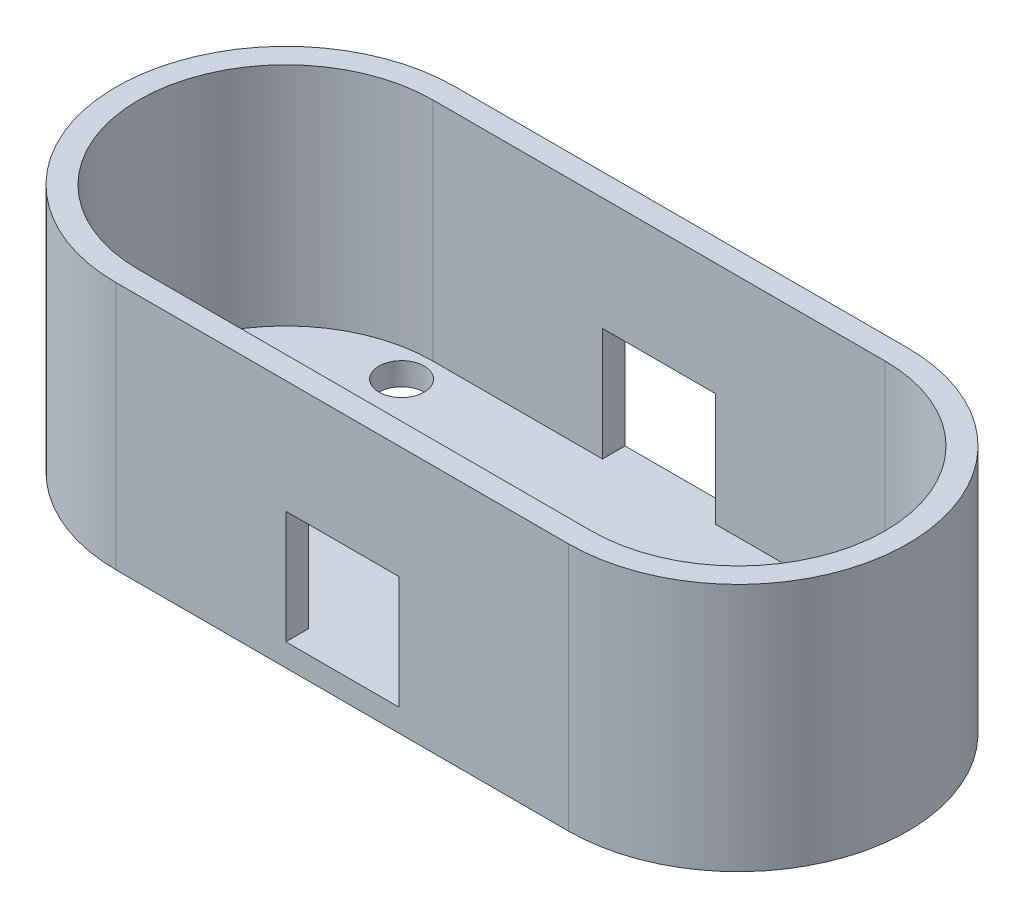
ISO-10303-21;
HEADER;
FILE_DESCRIPTION(('STEP AP214'),'2;1');
FILE_NAME('part.step','',(''),(''),'','','');
FILE_SCHEMA(('AUTOMOTIVE_DESIGN { 1 0 10303 214 1 1 1 1 }'));
ENDSEC;
DATA;
#1=APPLICATION_CONTEXT('core data for automotive mechanical design processes');
#2=APPLICATION_PROTOCOL_DEFINITION('international standard','automotive_design',2000,#1);
#3=PRODUCT_CONTEXT('',#1,'mechanical');
#4=PRODUCT('Part','Part','',(#3));
#5=PRODUCT_RELATED_PRODUCT_CATEGORY('part','',(#4));
#6=PRODUCT_DEFINITION_FORMATION('','',#4);
#7=PRODUCT_DEFINITION_CONTEXT('part definition',#1,'design');
#8=PRODUCT_DEFINITION('design','',#6,#7);
#9=PRODUCT_DEFINITION_SHAPE('','',#8);
#10=(LENGTH_UNIT() NAMED_UNIT(*) SI_UNIT(.MILLI.,.METRE.));
#11=(NAMED_UNIT(*) PLANE_ANGLE_UNIT() SI_UNIT($,.RADIAN.));
#12=(NAMED_UNIT(*) SI_UNIT($,.STERADIAN.) SOLID_ANGLE_UNIT());
#13=UNCERTAINTY_MEASURE_WITH_UNIT(LENGTH_MEASURE(1.E-05),#10,'distance_accuracy_value','');
#14=(GEOMETRIC_REPRESENTATION_CONTEXT(3) GLOBAL_UNCERTAINTY_ASSIGNED_CONTEXT((#13)) GLOBAL_UNIT_ASSIGNED_CONTEXT((#10,
#11,#12)) REPRESENTATION_CONTEXT('',''));
#15=CARTESIAN_POINT('',(0.,0.,0.));
#16=DIRECTION('',(0.,0.,1.));
#17=DIRECTION('',(1.,0.,0.));
#18=AXIS2_PLACEMENT_3D('',#15,#16,#17);
#19=CARTESIAN_POINT('',(0.,12.7,0.));
#20=DIRECTION('',(0.,1.,0.));
#21=DIRECTION('',(0.,0.,1.));
#22=AXIS2_PLACEMENT_3D('',#19,#20,#21);
#23=PLANE('',#22);
#24=CARTESIAN_POINT('',(0.,12.7,0.));
#25=DIRECTION('',(0.,1.,0.));
#26=DIRECTION('',(0.,0.,1.));
#27=AXIS2_PLACEMENT_3D('',#24,#25,#26);
#28=CIRCLE('',#27,9.525);
#29=CARTESIAN_POINT('',(0.,12.7,-9.525));
#30=VERTEX_POINT('',#29);
#31=CARTESIAN_POINT('',(0.,12.7,9.525));
#32=VERTEX_POINT('',#31);
#33=EDGE_CURVE('E255',#30,#32,#28,.T.);
#34=ORIENTED_EDGE('',*,*,#33,.T.);
#35=DIRECTION('',(1.,0.,0.));
#36=VECTOR('',#35,1.);
#37=CARTESIAN_POINT('',(0.,12.7,9.525));
#38=LINE('',#37,#36);
#39=CARTESIAN_POINT('',(25.4,12.7,9.525));
#40=VERTEX_POINT('',#39);
#41=EDGE_CURVE('E260',#32,#40,#38,.T.);
#42=ORIENTED_EDGE('',*,*,#41,.T.);
#43=CARTESIAN_POINT('',(25.4,12.7,0.));
#44=DIRECTION('',(0.,1.,0.));
#45=DIRECTION('',(0.,0.,1.));
#46=AXIS2_PLACEMENT_3D('',#43,#44,#45);
#47=CIRCLE('',#46,9.525);
#48=CARTESIAN_POINT('',(25.4,12.7,-9.525));
#49=VERTEX_POINT('',#48);
#50=EDGE_CURVE('E259',#40,#49,#47,.T.);
#51=ORIENTED_EDGE('',*,*,#50,.T.);
#52=DIRECTION('',(-1.,0.,0.));
#53=VECTOR('',#52,1.);
#54=CARTESIAN_POINT('',(0.,12.7,-9.525));
#55=LINE('',#54,#53);
#56=EDGE_CURVE('E261',#49,#30,#55,.T.);
#57=ORIENTED_EDGE('',*,*,#56,.T.);
#58=EDGE_LOOP('',(#34,#42,#51,#57));
#59=FACE_BOUND('',#58,.T.);
#60=DIRECTION('',(1.,0.,0.));
#61=VECTOR('',#60,1.);
#62=CARTESIAN_POINT('',(0.,12.7,8.255));
#63=LINE('',#62,#61);
#64=CARTESIAN_POINT('',(0.,12.7,8.255));
#65=VERTEX_POINT('',#64);
#66=CARTESIAN_POINT('',(25.4,12.7,8.255));
#67=VERTEX_POINT('',#66);
#68=EDGE_CURVE('E224',#65,#67,#63,.T.);
#69=ORIENTED_EDGE('',*,*,#68,.F.);
#70=CARTESIAN_POINT('',(0.,12.7,0.));
#71=DIRECTION('',(0.,1.,0.));
#72=DIRECTION('',(0.,0.,1.));
#73=AXIS2_PLACEMENT_3D('',#70,#71,#72);
#74=CIRCLE('',#73,8.255);
#75=CARTESIAN_POINT('',(0.,12.7,-8.255));
#76=VERTEX_POINT('',#75);
#77=EDGE_CURVE('E222',#76,#65,#74,.T.);
#78=ORIENTED_EDGE('',*,*,#77,.F.);
#79=DIRECTION('',(-1.,0.,0.));
#80=VECTOR('',#79,1.);
#81=CARTESIAN_POINT('',(0.,12.7,-8.255));
#82=LINE('',#81,#80);
#83=CARTESIAN_POINT('',(25.4,12.7,-8.255));
#84=VERTEX_POINT('',#83);
#85=EDGE_CURVE('E228',#84,#76,#82,.T.);
#86=ORIENTED_EDGE('',*,*,#85,.F.);
#87=CARTESIAN_POINT('',(25.4,12.7,0.));
#88=DIRECTION('',(0.,1.,0.));
#89=DIRECTION('',(0.,0.,1.));
#90=AXIS2_PLACEMENT_3D('',#87,#88,#89);
#91=CIRCLE('',#90,8.255);
#92=EDGE_CURVE('E229',#67,#84,#91,.T.);
#93=ORIENTED_EDGE('',*,*,#92,.F.);
#94=EDGE_LOOP('',(#69,#78,#86,#93));
#95=FACE_BOUND('',#94,.T.);
#96=ADVANCED_FACE('F39',(#59,#95),#23,.T.);
#97=CARTESIAN_POINT('',(0.,12.7,0.));
#98=DIRECTION('',(0.,-1.,0.));
#99=DIRECTION('',(0.,0.,-1.));
#100=AXIS2_PLACEMENT_3D('',#97,#98,#99);
#101=CYLINDRICAL_SURFACE('',#100,9.525);
#102=DIRECTION('',(0.,-1.,0.));
#103=VECTOR('',#102,1.);
#104=CARTESIAN_POINT('',(0.,12.7,-9.525));
#105=LINE('',#104,#103);
#106=CARTESIAN_POINT('',(0.,-1.27,-9.525));
#107=VERTEX_POINT('',#106);
#108=EDGE_CURVE('E263',#30,#107,#105,.T.);
#109=ORIENTED_EDGE('',*,*,#108,.T.);
#110=CARTESIAN_POINT('',(0.,-1.27,0.));
#111=DIRECTION('',(0.,-1.,0.));
#112=DIRECTION('',(0.,0.,-1.));
#113=AXIS2_PLACEMENT_3D('',#110,#111,#112);
#114=CIRCLE('',#113,9.525);
#115=CARTESIAN_POINT('',(0.,-1.27,9.525));
#116=VERTEX_POINT('',#115);
#117=EDGE_CURVE('E208',#116,#107,#114,.T.);
#118=ORIENTED_EDGE('',*,*,#117,.F.);
#119=DIRECTION('',(0.,-1.,0.));
#120=VECTOR('',#119,1.);
#121=CARTESIAN_POINT('',(0.,12.7,9.525));
#122=LINE('',#121,#120);
#123=EDGE_CURVE('E267',#32,#116,#122,.T.);
#124=ORIENTED_EDGE('',*,*,#123,.F.);
#125=ORIENTED_EDGE('',*,*,#33,.F.);
#126=EDGE_LOOP('',(#109,#118,#124,#125));
#127=FACE_BOUND('',#126,.T.);
#128=ADVANCED_FACE('F41',(#127),#101,.T.);
#129=CARTESIAN_POINT('',(0.,12.7,9.525));
#130=DIRECTION('',(0.,0.,-1.));
#131=DIRECTION('',(-1.,0.,0.));
#132=AXIS2_PLACEMENT_3D('',#129,#130,#131);
#133=PLANE('',#132);
#134=DIRECTION('',(-1.,0.,0.));
#135=VECTOR('',#134,1.);
#136=CARTESIAN_POINT('',(9.525,6.35,9.525));
#137=LINE('',#136,#135);
#138=CARTESIAN_POINT('',(15.875,6.35,9.525));
#139=VERTEX_POINT('',#138);
#140=CARTESIAN_POINT('',(9.525,6.35,9.525));
#141=VERTEX_POINT('',#140);
#142=EDGE_CURVE('E186',#139,#141,#137,.T.);
#143=ORIENTED_EDGE('',*,*,#142,.F.);
#144=DIRECTION('',(0.,1.,0.));
#145=VECTOR('',#144,1.);
#146=CARTESIAN_POINT('',(15.875,0.,9.525));
#147=LINE('',#146,#145);
#148=CARTESIAN_POINT('',(15.875,0.,9.525));
#149=VERTEX_POINT('',#148);
#150=EDGE_CURVE('E53',#149,#139,#147,.T.);
#151=ORIENTED_EDGE('',*,*,#150,.F.);
#152=DIRECTION('',(1.,0.,0.));
#153=VECTOR('',#152,1.);
#154=CARTESIAN_POINT('',(9.525,0.,9.525));
#155=LINE('',#154,#153);
#156=CARTESIAN_POINT('',(9.525,0.,9.525));
#157=VERTEX_POINT('',#156);
#158=EDGE_CURVE('E172',#157,#149,#155,.T.);
#159=ORIENTED_EDGE('',*,*,#158,.F.);
#160=DIRECTION('',(0.,-1.,0.));
#161=VECTOR('',#160,1.);
#162=CARTESIAN_POINT('',(9.525,0.,9.525));
#163=LINE('',#162,#161);
#164=EDGE_CURVE('E178',#141,#157,#163,.T.);
#165=ORIENTED_EDGE('',*,*,#164,.F.);
#166=EDGE_LOOP('',(#143,#151,#159,#165));
#167=FACE_BOUND('',#166,.T.);
#168=ORIENTED_EDGE('',*,*,#123,.T.);
#169=DIRECTION('',(-1.,0.,0.));
#170=VECTOR('',#169,1.);
#171=CARTESIAN_POINT('',(0.,-1.27,9.525));
#172=LINE('',#171,#170);
#173=CARTESIAN_POINT('',(25.4,-1.27,9.525));
#174=VERTEX_POINT('',#173);
#175=EDGE_CURVE('E220',#174,#116,#172,.T.);
#176=ORIENTED_EDGE('',*,*,#175,.F.);
#177=DIRECTION('',(0.,-1.,0.));
#178=VECTOR('',#177,1.);
#179=CARTESIAN_POINT('',(25.4,12.7,9.525));
#180=LINE('',#179,#178);
#181=EDGE_CURVE('E270',#40,#174,#180,.T.);
#182=ORIENTED_EDGE('',*,*,#181,.F.);
#183=ORIENTED_EDGE('',*,*,#41,.F.);
#184=EDGE_LOOP('',(#168,#176,#182,#183));
#185=FACE_BOUND('',#184,.T.);
#186=ADVANCED_FACE('F300',(#167,#185),#133,.F.);
#187=CARTESIAN_POINT('',(25.4,12.7,0.));
#188=DIRECTION('',(0.,-1.,0.));
#189=DIRECTION('',(0.,0.,-1.));
#190=AXIS2_PLACEMENT_3D('',#187,#188,#189);
#191=CYLINDRICAL_SURFACE('',#190,9.525);
#192=ORIENTED_EDGE('',*,*,#181,.T.);
#193=CARTESIAN_POINT('',(25.4,-1.27,0.));
#194=DIRECTION('',(0.,-1.,0.));
#195=DIRECTION('',(0.,0.,-1.));
#196=AXIS2_PLACEMENT_3D('',#193,#194,#195);
#197=CIRCLE('',#196,9.525);
#198=CARTESIAN_POINT('',(25.4,-1.27,-9.525));
#199=VERTEX_POINT('',#198);
#200=EDGE_CURVE('E212',#199,#174,#197,.T.);
#201=ORIENTED_EDGE('',*,*,#200,.F.);
#202=DIRECTION('',(0.,-1.,0.));
#203=VECTOR('',#202,1.);
#204=CARTESIAN_POINT('',(25.4,12.7,-9.525));
#205=LINE('',#204,#203);
#206=EDGE_CURVE('E264',#49,#199,#205,.T.);
#207=ORIENTED_EDGE('',*,*,#206,.F.);
#208=ORIENTED_EDGE('',*,*,#50,.F.);
#209=EDGE_LOOP('',(#192,#201,#207,#208));
#210=FACE_BOUND('',#209,.T.);
#211=ADVANCED_FACE('F321',(#210),#191,.T.);
#212=CARTESIAN_POINT('',(0.,12.7,-9.525));
#213=DIRECTION('',(0.,0.,1.));
#214=DIRECTION('',(1.,0.,0.));
#215=AXIS2_PLACEMENT_3D('',#212,#213,#214);
#216=PLANE('',#215);
#217=DIRECTION('',(1.,0.,0.));
#218=VECTOR('',#217,1.);
#219=CARTESIAN_POINT('',(9.525,0.,-9.525));
#220=LINE('',#219,#218);
#221=CARTESIAN_POINT('',(9.525,0.,-9.525));
#222=VERTEX_POINT('',#221);
#223=CARTESIAN_POINT('',(15.875,0.,-9.525));
#224=VERTEX_POINT('',#223);
#225=EDGE_CURVE('E173',#222,#224,#220,.T.);
#226=ORIENTED_EDGE('',*,*,#225,.T.);
#227=DIRECTION('',(0.,1.,0.));
#228=VECTOR('',#227,1.);
#229=CARTESIAN_POINT('',(15.875,0.,-9.525));
#230=LINE('',#229,#228);
#231=CARTESIAN_POINT('',(15.875,6.35,-9.525));
#232=VERTEX_POINT('',#231);
#233=EDGE_CURVE('E160',#224,#232,#230,.T.);
#234=ORIENTED_EDGE('',*,*,#233,.T.);
#235=DIRECTION('',(-1.,0.,0.));
#236=VECTOR('',#235,1.);
#237=CARTESIAN_POINT('',(9.525,6.35,-9.525));
#238=LINE('',#237,#236);
#239=CARTESIAN_POINT('',(9.525,6.35,-9.525));
#240=VERTEX_POINT('',#239);
#241=EDGE_CURVE('E167',#232,#240,#238,.T.);
#242=ORIENTED_EDGE('',*,*,#241,.T.);
#243=DIRECTION('',(0.,-1.,0.));
#244=VECTOR('',#243,1.);
#245=CARTESIAN_POINT('',(9.525,0.,-9.525));
#246=LINE('',#245,#244);
#247=EDGE_CURVE('E61',#240,#222,#246,.T.);
#248=ORIENTED_EDGE('',*,*,#247,.T.);
#249=EDGE_LOOP('',(#226,#234,#242,#248));
#250=FACE_BOUND('',#249,.T.);
#251=ORIENTED_EDGE('',*,*,#206,.T.);
#252=DIRECTION('',(1.,0.,0.));
#253=VECTOR('',#252,1.);
#254=CARTESIAN_POINT('',(0.,-1.27,-9.525));
#255=LINE('',#254,#253);
#256=EDGE_CURVE('E211',#107,#199,#255,.T.);
#257=ORIENTED_EDGE('',*,*,#256,.F.);
#258=ORIENTED_EDGE('',*,*,#108,.F.);
#259=ORIENTED_EDGE('',*,*,#56,.F.);
#260=EDGE_LOOP('',(#251,#257,#258,#259));
#261=FACE_BOUND('',#260,.T.);
#262=ADVANCED_FACE('F174',(#250,#261),#216,.F.);
#263=CARTESIAN_POINT('',(0.,12.7,0.));
#264=DIRECTION('',(0.,-1.,0.));
#265=DIRECTION('',(0.,0.,-1.));
#266=AXIS2_PLACEMENT_3D('',#263,#264,#265);
#267=CYLINDRICAL_SURFACE('',#266,8.255);
#268=CARTESIAN_POINT('',(0.,0.,0.));
#269=DIRECTION('',(0.,1.,0.));
#270=DIRECTION('',(0.,0.,1.));
#271=AXIS2_PLACEMENT_3D('',#268,#269,#270);
#272=CIRCLE('',#271,8.255);
#273=CARTESIAN_POINT('',(0.,0.,-8.255));
#274=VERTEX_POINT('',#273);
#275=CARTESIAN_POINT('',(0.,0.,8.255));
#276=VERTEX_POINT('',#275);
#277=EDGE_CURVE('E219',#274,#276,#272,.T.);
#278=ORIENTED_EDGE('',*,*,#277,.F.);
#279=DIRECTION('',(0.,-1.,0.));
#280=VECTOR('',#279,1.);
#281=CARTESIAN_POINT('',(0.,12.7,-8.255));
#282=LINE('',#281,#280);
#283=EDGE_CURVE('E231',#76,#274,#282,.T.);
#284=ORIENTED_EDGE('',*,*,#283,.F.);
#285=ORIENTED_EDGE('',*,*,#77,.T.);
#286=DIRECTION('',(0.,-1.,0.));
#287=VECTOR('',#286,1.);
#288=CARTESIAN_POINT('',(0.,12.7,8.255));
#289=LINE('',#288,#287);
#290=EDGE_CURVE('E253',#65,#276,#289,.T.);
#291=ORIENTED_EDGE('',*,*,#290,.T.);
#292=EDGE_LOOP('',(#278,#284,#285,#291));
#293=FACE_BOUND('',#292,.T.);
#294=ADVANCED_FACE('F283',(#293),#267,.F.);
#295=CARTESIAN_POINT('',(0.,12.7,8.255));
#296=DIRECTION('',(0.,0.,-1.));
#297=DIRECTION('',(-1.,0.,0.));
#298=AXIS2_PLACEMENT_3D('',#295,#296,#297);
#299=PLANE('',#298);
#300=DIRECTION('',(0.,-1.,0.));
#301=VECTOR('',#300,1.);
#302=CARTESIAN_POINT('',(15.875,12.7,8.255));
#303=LINE('',#302,#301);
#304=CARTESIAN_POINT('',(15.875,6.35,8.25499999999999));
#305=VERTEX_POINT('',#304);
#306=CARTESIAN_POINT('',(15.875,0.,8.25499999999999));
#307=VERTEX_POINT('',#306);
#308=EDGE_CURVE('E206',#305,#307,#303,.T.);
#309=ORIENTED_EDGE('',*,*,#308,.F.);
#310=DIRECTION('',(1.,0.,0.));
#311=VECTOR('',#310,1.);
#312=CARTESIAN_POINT('',(0.,6.35,8.255));
#313=LINE('',#312,#311);
#314=CARTESIAN_POINT('',(9.525,6.35,8.255));
#315=VERTEX_POINT('',#314);
#316=EDGE_CURVE('E194',#315,#305,#313,.T.);
#317=ORIENTED_EDGE('',*,*,#316,.F.);
#318=DIRECTION('',(0.,1.,0.));
#319=VECTOR('',#318,1.);
#320=CARTESIAN_POINT('',(9.525,12.7,8.255));
#321=LINE('',#320,#319);
#322=CARTESIAN_POINT('',(9.525,0.,8.25499999999999));
#323=VERTEX_POINT('',#322);
#324=EDGE_CURVE('E201',#323,#315,#321,.T.);
#325=ORIENTED_EDGE('',*,*,#324,.F.);
#326=DIRECTION('',(1.,0.,0.));
#327=VECTOR('',#326,1.);
#328=CARTESIAN_POINT('',(0.,0.,8.255));
#329=LINE('',#328,#327);
#330=EDGE_CURVE('E234',#276,#323,#329,.T.);
#331=ORIENTED_EDGE('',*,*,#330,.F.);
#332=ORIENTED_EDGE('',*,*,#290,.F.);
#333=ORIENTED_EDGE('',*,*,#68,.T.);
#334=DIRECTION('',(0.,-1.,0.));
#335=VECTOR('',#334,1.);
#336=CARTESIAN_POINT('',(25.4,12.7,8.255));
#337=LINE('',#336,#335);
#338=CARTESIAN_POINT('',(25.4,0.,8.255));
#339=VERTEX_POINT('',#338);
#340=EDGE_CURVE('E248',#67,#339,#337,.T.);
#341=ORIENTED_EDGE('',*,*,#340,.T.);
#342=EDGE_CURVE('E232',#307,#339,#329,.T.);
#343=ORIENTED_EDGE('',*,*,#342,.F.);
#344=EDGE_LOOP('',(#309,#317,#325,#331,#332,#333,#341,#343));
#345=FACE_BOUND('',#344,.T.);
#346=ADVANCED_FACE('F287',(#345),#299,.T.);
#347=CARTESIAN_POINT('',(25.4,12.7,0.));
#348=DIRECTION('',(0.,-1.,0.));
#349=DIRECTION('',(0.,0.,-1.));
#350=AXIS2_PLACEMENT_3D('',#347,#348,#349);
#351=CYLINDRICAL_SURFACE('',#350,8.255);
#352=CARTESIAN_POINT('',(25.4,0.,0.));
#353=DIRECTION('',(0.,1.,0.));
#354=DIRECTION('',(0.,0.,1.));
#355=AXIS2_PLACEMENT_3D('',#352,#353,#354);
#356=CIRCLE('',#355,8.255);
#357=CARTESIAN_POINT('',(25.4,0.,-8.255));
#358=VERTEX_POINT('',#357);
#359=EDGE_CURVE('E236',#339,#358,#356,.T.);
#360=ORIENTED_EDGE('',*,*,#359,.F.);
#361=ORIENTED_EDGE('',*,*,#340,.F.);
#362=ORIENTED_EDGE('',*,*,#92,.T.);
#363=DIRECTION('',(0.,-1.,0.));
#364=VECTOR('',#363,1.);
#365=CARTESIAN_POINT('',(25.4,12.7,-8.255));
#366=LINE('',#365,#364);
#367=EDGE_CURVE('E246',#84,#358,#366,.T.);
#368=ORIENTED_EDGE('',*,*,#367,.T.);
#369=EDGE_LOOP('',(#360,#361,#362,#368));
#370=FACE_BOUND('',#369,.T.);
#371=ADVANCED_FACE('F308',(#370),#351,.F.);
#372=CARTESIAN_POINT('',(0.,12.7,-8.255));
#373=DIRECTION('',(0.,0.,1.));
#374=DIRECTION('',(1.,0.,0.));
#375=AXIS2_PLACEMENT_3D('',#372,#373,#374);
#376=PLANE('',#375);
#377=DIRECTION('',(0.,1.,0.));
#378=VECTOR('',#377,1.);
#379=CARTESIAN_POINT('',(15.875,12.7,-8.255));
#380=LINE('',#379,#378);
#381=CARTESIAN_POINT('',(15.875,0.,-8.255));
#382=VERTEX_POINT('',#381);
#383=CARTESIAN_POINT('',(15.875,6.35,-8.255));
#384=VERTEX_POINT('',#383);
#385=EDGE_CURVE('E11',#382,#384,#380,.T.);
#386=ORIENTED_EDGE('',*,*,#385,.F.);
#387=DIRECTION('',(-1.,0.,0.));
#388=VECTOR('',#387,1.);
#389=CARTESIAN_POINT('',(0.,0.,-8.255));
#390=LINE('',#389,#388);
#391=EDGE_CURVE('E221',#358,#382,#390,.T.);
#392=ORIENTED_EDGE('',*,*,#391,.F.);
#393=ORIENTED_EDGE('',*,*,#367,.F.);
#394=ORIENTED_EDGE('',*,*,#85,.T.);
#395=ORIENTED_EDGE('',*,*,#283,.T.);
#396=CARTESIAN_POINT('',(9.525,0.,-8.255));
#397=VERTEX_POINT('',#396);
#398=EDGE_CURVE('E244',#397,#274,#390,.T.);
#399=ORIENTED_EDGE('',*,*,#398,.F.);
#400=DIRECTION('',(0.,-1.,0.));
#401=VECTOR('',#400,1.);
#402=CARTESIAN_POINT('',(9.525,12.7,-8.255));
#403=LINE('',#402,#401);
#404=CARTESIAN_POINT('',(9.525,6.35,-8.255));
#405=VERTEX_POINT('',#404);
#406=EDGE_CURVE('E50',#405,#397,#403,.T.);
#407=ORIENTED_EDGE('',*,*,#406,.F.);
#408=DIRECTION('',(-1.,0.,0.));
#409=VECTOR('',#408,1.);
#410=CARTESIAN_POINT('',(0.,6.35,-8.255));
#411=LINE('',#410,#409);
#412=EDGE_CURVE('E271',#384,#405,#411,.T.);
#413=ORIENTED_EDGE('',*,*,#412,.F.);
#414=EDGE_LOOP('',(#386,#392,#393,#394,#395,#399,#407,#413));
#415=FACE_BOUND('',#414,.T.);
#416=ADVANCED_FACE('F279',(#415),#376,.T.);
#417=CARTESIAN_POINT('',(0.,0.,0.));
#418=DIRECTION('',(0.,-1.,0.));
#419=DIRECTION('',(0.,0.,-1.));
#420=AXIS2_PLACEMENT_3D('',#417,#418,#419);
#421=PLANE('',#420);
#422=CARTESIAN_POINT('',(-6.12696280991736,0.,0.));
#423=DIRECTION('',(0.,1.,0.));
#424=DIRECTION('',(0.,0.,1.));
#425=AXIS2_PLACEMENT_3D('',#422,#423,#424);
#426=CIRCLE('',#425,1.27);
#427=CARTESIAN_POINT('',(-6.12696280991736,0.,1.27));
#428=VERTEX_POINT('',#427);
#429=EDGE_CURVE('E190',#428,#428,#426,.T.);
#430=ORIENTED_EDGE('',*,*,#429,.F.);
#431=EDGE_LOOP('',(#430));
#432=FACE_BOUND('',#431,.T.);
#433=CARTESIAN_POINT('',(26.6353773795487,0.,5.99175365078963));
#434=DIRECTION('',(0.,1.,0.));
#435=DIRECTION('',(0.,0.,1.));
#436=AXIS2_PLACEMENT_3D('',#433,#434,#435);
#437=CIRCLE('',#436,1.27);
#438=CARTESIAN_POINT('',(26.6353773795487,0.,7.26175365078963));
#439=VERTEX_POINT('',#438);
#440=EDGE_CURVE('E537',#439,#439,#437,.T.);
#441=ORIENTED_EDGE('',*,*,#440,.F.);
#442=EDGE_LOOP('',(#441));
#443=FACE_BOUND('',#442,.T.);
#444=CARTESIAN_POINT('',(32.1908039212069,0.,0.));
#445=DIRECTION('',(0.,1.,0.));
#446=DIRECTION('',(0.,0.,1.));
#447=AXIS2_PLACEMENT_3D('',#444,#445,#446);
#448=CIRCLE('',#447,1.27);
#449=CARTESIAN_POINT('',(32.1908039212069,0.,1.27));
#450=VERTEX_POINT('',#449);
#451=EDGE_CURVE('E553',#450,#450,#448,.T.);
#452=ORIENTED_EDGE('',*,*,#451,.F.);
#453=EDGE_LOOP('',(#452));
#454=FACE_BOUND('',#453,.T.);
#455=CARTESIAN_POINT('',(0.,0.,-6.49969621112412));
#456=DIRECTION('',(0.,1.,0.));
#457=DIRECTION('',(0.,0.,1.));
#458=AXIS2_PLACEMENT_3D('',#455,#456,#457);
#459=CIRCLE('',#458,1.27);
#460=CARTESIAN_POINT('',(0.,0.,-5.22969621112412));
#461=VERTEX_POINT('',#460);
#462=EDGE_CURVE('E182',#461,#461,#459,.T.);
#463=ORIENTED_EDGE('',*,*,#462,.F.);
#464=EDGE_LOOP('',(#463));
#465=FACE_BOUND('',#464,.T.);
#466=CARTESIAN_POINT('',(0.,0.,5.99175365078963));
#467=DIRECTION('',(0.,1.,0.));
#468=DIRECTION('',(0.,0.,1.));
#469=AXIS2_PLACEMENT_3D('',#466,#467,#468);
#470=CIRCLE('',#469,1.27);
#471=CARTESIAN_POINT('',(0.,0.,7.26175365078963));
#472=VERTEX_POINT('',#471);
#473=EDGE_CURVE('E544',#472,#472,#470,.T.);
#474=ORIENTED_EDGE('',*,*,#473,.F.);
#475=EDGE_LOOP('',(#474));
#476=FACE_BOUND('',#475,.T.);
#477=CARTESIAN_POINT('',(26.6353773795487,0.,-6.49969621112412));
#478=DIRECTION('',(0.,1.,0.));
#479=DIRECTION('',(0.,0.,1.));
#480=AXIS2_PLACEMENT_3D('',#477,#478,#479);
#481=CIRCLE('',#480,1.27);
#482=CARTESIAN_POINT('',(26.6353773795487,0.,-5.22969621112412));
#483=VERTEX_POINT('',#482);
#484=EDGE_CURVE('E538',#483,#483,#481,.T.);
#485=ORIENTED_EDGE('',*,*,#484,.F.);
#486=EDGE_LOOP('',(#485));
#487=FACE_BOUND('',#486,.T.);
#488=ORIENTED_EDGE('',*,*,#391,.T.);
#489=DIRECTION('',(0.,0.,1.));
#490=VECTOR('',#489,1.);
#491=CARTESIAN_POINT('',(15.875,0.,-9.525));
#492=LINE('',#491,#490);
#493=EDGE_CURVE('E193',#224,#382,#492,.T.);
#494=ORIENTED_EDGE('',*,*,#493,.F.);
#495=ORIENTED_EDGE('',*,*,#225,.F.);
#496=DIRECTION('',(0.,0.,1.));
#497=VECTOR('',#496,1.);
#498=CARTESIAN_POINT('',(9.525,0.,-9.525));
#499=LINE('',#498,#497);
#500=EDGE_CURVE('E197',#222,#397,#499,.T.);
#501=ORIENTED_EDGE('',*,*,#500,.T.);
#502=ORIENTED_EDGE('',*,*,#398,.T.);
#503=ORIENTED_EDGE('',*,*,#277,.T.);
#504=ORIENTED_EDGE('',*,*,#330,.T.);
#505=EDGE_CURVE('E199',#323,#157,#499,.T.);
#506=ORIENTED_EDGE('',*,*,#505,.T.);
#507=ORIENTED_EDGE('',*,*,#158,.T.);
#508=EDGE_CURVE('E198',#307,#149,#492,.T.);
#509=ORIENTED_EDGE('',*,*,#508,.F.);
#510=ORIENTED_EDGE('',*,*,#342,.T.);
#511=ORIENTED_EDGE('',*,*,#359,.T.);
#512=EDGE_LOOP('',(#488,#494,#495,#501,#502,#503,#504,#506,#507,#509,#510,#511));
#513=FACE_BOUND('',#512,.T.);
#514=ADVANCED_FACE('F280',(#432,#443,#454,#465,#476,#487,#513),#421,.F.);
#515=CARTESIAN_POINT('',(0.,-1.27,0.));
#516=DIRECTION('',(0.,-1.,0.));
#517=DIRECTION('',(0.,0.,-1.));
#518=AXIS2_PLACEMENT_3D('',#515,#516,#517);
#519=PLANE('',#518);
#520=CARTESIAN_POINT('',(-6.12696280991736,-1.27,0.));
#521=DIRECTION('',(0.,-1.,0.));
#522=DIRECTION('',(0.,0.,-1.));
#523=AXIS2_PLACEMENT_3D('',#520,#521,#522);
#524=CIRCLE('',#523,1.27);
#525=CARTESIAN_POINT('',(-6.12696280991736,-1.27,-1.27));
#526=VERTEX_POINT('',#525);
#527=EDGE_CURVE('E526',#526,#526,#524,.F.);
#528=ORIENTED_EDGE('',*,*,#527,.T.);
#529=EDGE_LOOP('',(#528));
#530=FACE_BOUND('',#529,.T.);
#531=CARTESIAN_POINT('',(26.6353773795487,-1.27,5.99175365078963));
#532=DIRECTION('',(0.,-1.,0.));
#533=DIRECTION('',(0.,0.,-1.));
#534=AXIS2_PLACEMENT_3D('',#531,#532,#533);
#535=CIRCLE('',#534,1.27);
#536=CARTESIAN_POINT('',(26.6353773795487,-1.27,4.72175365078964));
#537=VERTEX_POINT('',#536);
#538=EDGE_CURVE('E532',#537,#537,#535,.F.);
#539=ORIENTED_EDGE('',*,*,#538,.T.);
#540=EDGE_LOOP('',(#539));
#541=FACE_BOUND('',#540,.T.);
#542=CARTESIAN_POINT('',(32.1908039212069,-1.27,0.));
#543=DIRECTION('',(0.,-1.,0.));
#544=DIRECTION('',(0.,0.,-1.));
#545=AXIS2_PLACEMENT_3D('',#542,#543,#544);
#546=CIRCLE('',#545,1.27);
#547=CARTESIAN_POINT('',(32.1908039212069,-1.27,-1.27));
#548=VERTEX_POINT('',#547);
#549=EDGE_CURVE('E535',#548,#548,#546,.F.);
#550=ORIENTED_EDGE('',*,*,#549,.T.);
#551=EDGE_LOOP('',(#550));
#552=FACE_BOUND('',#551,.T.);
#553=CARTESIAN_POINT('',(0.,-1.27,-6.49969621112412));
#554=DIRECTION('',(0.,-1.,0.));
#555=DIRECTION('',(0.,0.,-1.));
#556=AXIS2_PLACEMENT_3D('',#553,#554,#555);
#557=CIRCLE('',#556,1.27);
#558=CARTESIAN_POINT('',(0.,-1.27,-7.76969621112412));
#559=VERTEX_POINT('',#558);
#560=EDGE_CURVE('E556',#559,#559,#557,.F.);
#561=ORIENTED_EDGE('',*,*,#560,.T.);
#562=EDGE_LOOP('',(#561));
#563=FACE_BOUND('',#562,.T.);
#564=CARTESIAN_POINT('',(0.,-1.27,5.99175365078963));
#565=DIRECTION('',(0.,-1.,0.));
#566=DIRECTION('',(0.,0.,-1.));
#567=AXIS2_PLACEMENT_3D('',#564,#565,#566);
#568=CIRCLE('',#567,1.27);
#569=CARTESIAN_POINT('',(0.,-1.27,4.72175365078963));
#570=VERTEX_POINT('',#569);
#571=EDGE_CURVE('E545',#570,#570,#568,.F.);
#572=ORIENTED_EDGE('',*,*,#571,.T.);
#573=EDGE_LOOP('',(#572));
#574=FACE_BOUND('',#573,.T.);
#575=CARTESIAN_POINT('',(26.6353773795487,-1.27,-6.49969621112412));
#576=DIRECTION('',(0.,-1.,0.));
#577=DIRECTION('',(0.,0.,-1.));
#578=AXIS2_PLACEMENT_3D('',#575,#576,#577);
#579=CIRCLE('',#578,1.27);
#580=CARTESIAN_POINT('',(26.6353773795487,-1.27,-7.76969621112412));
#581=VERTEX_POINT('',#580);
#582=EDGE_CURVE('E547',#581,#581,#579,.F.);
#583=ORIENTED_EDGE('',*,*,#582,.T.);
#584=EDGE_LOOP('',(#583));
#585=FACE_BOUND('',#584,.T.);
#586=ORIENTED_EDGE('',*,*,#117,.T.);
#587=ORIENTED_EDGE('',*,*,#256,.T.);
#588=ORIENTED_EDGE('',*,*,#200,.T.);
#589=ORIENTED_EDGE('',*,*,#175,.T.);
#590=EDGE_LOOP('',(#586,#587,#588,#589));
#591=FACE_BOUND('',#590,.T.);
#592=ADVANCED_FACE('F359',(#530,#541,#552,#563,#574,#585,#591),#519,.T.);
#593=CARTESIAN_POINT('',(9.525,6.35,-9.525));
#594=DIRECTION('',(0.,1.,0.));
#595=DIRECTION('',(0.,0.,1.));
#596=AXIS2_PLACEMENT_3D('',#593,#594,#595);
#597=PLANE('',#596);
#598=ORIENTED_EDGE('',*,*,#412,.T.);
#599=DIRECTION('',(0.,0.,1.));
#600=VECTOR('',#599,1.);
#601=CARTESIAN_POINT('',(9.525,6.35,-9.525));
#602=LINE('',#601,#600);
#603=EDGE_CURVE('E169',#240,#405,#602,.T.);
#604=ORIENTED_EDGE('',*,*,#603,.F.);
#605=ORIENTED_EDGE('',*,*,#241,.F.);
#606=DIRECTION('',(0.,0.,1.));
#607=VECTOR('',#606,1.);
#608=CARTESIAN_POINT('',(15.875,6.35,-9.525));
#609=LINE('',#608,#607);
#610=EDGE_CURVE('E153',#232,#384,#609,.T.);
#611=ORIENTED_EDGE('',*,*,#610,.T.);
#612=EDGE_LOOP('',(#598,#604,#605,#611));
#613=FACE_BOUND('',#612,.T.);
#614=ADVANCED_FACE('F170',(#613),#597,.F.);
#615=CARTESIAN_POINT('',(9.525,0.,-9.525));
#616=DIRECTION('',(-1.,0.,0.));
#617=DIRECTION('',(0.,0.,1.));
#618=AXIS2_PLACEMENT_3D('',#615,#616,#617);
#619=PLANE('',#618);
#620=ORIENTED_EDGE('',*,*,#406,.T.);
#621=ORIENTED_EDGE('',*,*,#500,.F.);
#622=ORIENTED_EDGE('',*,*,#247,.F.);
#623=ORIENTED_EDGE('',*,*,#603,.T.);
#624=EDGE_LOOP('',(#620,#621,#622,#623));
#625=FACE_BOUND('',#624,.T.);
#626=ADVANCED_FACE('F272',(#625),#619,.F.);
#627=CARTESIAN_POINT('',(15.875,0.,-9.525));
#628=DIRECTION('',(1.,0.,0.));
#629=DIRECTION('',(0.,0.,-1.));
#630=AXIS2_PLACEMENT_3D('',#627,#628,#629);
#631=PLANE('',#630);
#632=ORIENTED_EDGE('',*,*,#385,.T.);
#633=ORIENTED_EDGE('',*,*,#610,.F.);
#634=ORIENTED_EDGE('',*,*,#233,.F.);
#635=ORIENTED_EDGE('',*,*,#493,.T.);
#636=EDGE_LOOP('',(#632,#633,#634,#635));
#637=FACE_BOUND('',#636,.T.);
#638=ADVANCED_FACE('F154',(#637),#631,.F.);
#639=ORIENTED_EDGE('',*,*,#308,.T.);
#640=ORIENTED_EDGE('',*,*,#508,.T.);
#641=ORIENTED_EDGE('',*,*,#150,.T.);
#642=EDGE_CURVE('E162',#305,#139,#609,.T.);
#643=ORIENTED_EDGE('',*,*,#642,.F.);
#644=EDGE_LOOP('',(#639,#640,#641,#643));
#645=FACE_BOUND('',#644,.T.);
#646=ADVANCED_FACE('F380',(#645),#631,.F.);
#647=ORIENTED_EDGE('',*,*,#324,.T.);
#648=EDGE_CURVE('E165',#315,#141,#602,.T.);
#649=ORIENTED_EDGE('',*,*,#648,.T.);
#650=ORIENTED_EDGE('',*,*,#164,.T.);
#651=ORIENTED_EDGE('',*,*,#505,.F.);
#652=EDGE_LOOP('',(#647,#649,#650,#651));
#653=FACE_BOUND('',#652,.T.);
#654=ADVANCED_FACE('F291',(#653),#619,.F.);
#655=ORIENTED_EDGE('',*,*,#316,.T.);
#656=ORIENTED_EDGE('',*,*,#642,.T.);
#657=ORIENTED_EDGE('',*,*,#142,.T.);
#658=ORIENTED_EDGE('',*,*,#648,.F.);
#659=EDGE_LOOP('',(#655,#656,#657,#658));
#660=FACE_BOUND('',#659,.T.);
#661=ADVANCED_FACE('F362',(#660),#597,.F.);
#662=CARTESIAN_POINT('',(26.6353773795487,-1.271,-6.49969621112412));
#663=DIRECTION('',(0.,1.,0.));
#664=DIRECTION('',(0.,0.,1.));
#665=AXIS2_PLACEMENT_3D('',#662,#663,#664);
#666=CYLINDRICAL_SURFACE('',#665,1.27);
#667=ORIENTED_EDGE('',*,*,#582,.F.);
#668=EDGE_LOOP('',(#667));
#669=FACE_BOUND('',#668,.T.);
#670=ORIENTED_EDGE('',*,*,#484,.T.);
#671=EDGE_LOOP('',(#670));
#672=FACE_BOUND('',#671,.T.);
#673=ADVANCED_FACE('F400',(#669,#672),#666,.F.);
#674=CARTESIAN_POINT('',(0.,-1.271,5.99175365078963));
#675=DIRECTION('',(0.,1.,0.));
#676=DIRECTION('',(0.,0.,1.));
#677=AXIS2_PLACEMENT_3D('',#674,#675,#676);
#678=CYLINDRICAL_SURFACE('',#677,1.27);
#679=ORIENTED_EDGE('',*,*,#571,.F.);
#680=EDGE_LOOP('',(#679));
#681=FACE_BOUND('',#680,.T.);
#682=ORIENTED_EDGE('',*,*,#473,.T.);
#683=EDGE_LOOP('',(#682));
#684=FACE_BOUND('',#683,.T.);
#685=ADVANCED_FACE('F420',(#681,#684),#678,.F.);
#686=CARTESIAN_POINT('',(0.,-1.271,-6.49969621112412));
#687=DIRECTION('',(0.,1.,0.));
#688=DIRECTION('',(0.,0.,1.));
#689=AXIS2_PLACEMENT_3D('',#686,#687,#688);
#690=CYLINDRICAL_SURFACE('',#689,1.27);
#691=ORIENTED_EDGE('',*,*,#560,.F.);
#692=EDGE_LOOP('',(#691));
#693=FACE_BOUND('',#692,.T.);
#694=ORIENTED_EDGE('',*,*,#462,.T.);
#695=EDGE_LOOP('',(#694));
#696=FACE_BOUND('',#695,.T.);
#697=ADVANCED_FACE('F428',(#693,#696),#690,.F.);
#698=CARTESIAN_POINT('',(32.1908039212069,-1.271,0.));
#699=DIRECTION('',(0.,1.,0.));
#700=DIRECTION('',(0.,0.,1.));
#701=AXIS2_PLACEMENT_3D('',#698,#699,#700);
#702=CYLINDRICAL_SURFACE('',#701,1.27);
#703=ORIENTED_EDGE('',*,*,#549,.F.);
#704=EDGE_LOOP('',(#703));
#705=FACE_BOUND('',#704,.T.);
#706=ORIENTED_EDGE('',*,*,#451,.T.);
#707=EDGE_LOOP('',(#706));
#708=FACE_BOUND('',#707,.T.);
#709=ADVANCED_FACE('F440',(#705,#708),#702,.F.);
#710=CARTESIAN_POINT('',(26.6353773795487,-1.271,5.99175365078963));
#711=DIRECTION('',(0.,1.,0.));
#712=DIRECTION('',(0.,0.,1.));
#713=AXIS2_PLACEMENT_3D('',#710,#711,#712);
#714=CYLINDRICAL_SURFACE('',#713,1.27);
#715=ORIENTED_EDGE('',*,*,#538,.F.);
#716=EDGE_LOOP('',(#715));
#717=FACE_BOUND('',#716,.T.);
#718=ORIENTED_EDGE('',*,*,#440,.T.);
#719=EDGE_LOOP('',(#718));
#720=FACE_BOUND('',#719,.T.);
#721=ADVANCED_FACE('F449',(#717,#720),#714,.F.);
#722=CARTESIAN_POINT('',(-6.12696280991736,-1.271,0.));
#723=DIRECTION('',(0.,1.,0.));
#724=DIRECTION('',(0.,0.,1.));
#725=AXIS2_PLACEMENT_3D('',#722,#723,#724);
#726=CYLINDRICAL_SURFACE('',#725,1.27);
#727=ORIENTED_EDGE('',*,*,#527,.F.);
#728=EDGE_LOOP('',(#727));
#729=FACE_BOUND('',#728,.T.);
#730=ORIENTED_EDGE('',*,*,#429,.T.);
#731=EDGE_LOOP('',(#730));
#732=FACE_BOUND('',#731,.T.);
#733=ADVANCED_FACE('F454',(#729,#732),#726,.F.);
#734=CLOSED_SHELL('',(#96,#128,#186,#211,#262,#294,#346,#371,#416,#514,#592,#614,#626,#638,#646,
#654,#661,#673,#685,#697,#709,#721,#733));
#735=MANIFOLD_SOLID_BREP('B2',#734);
#736=ADVANCED_BREP_SHAPE_REPRESENTATION('',(#18,#735),#14);
#737=SHAPE_DEFINITION_REPRESENTATION(#9,#736);
ENDSEC;
END-ISO-10303-21;
